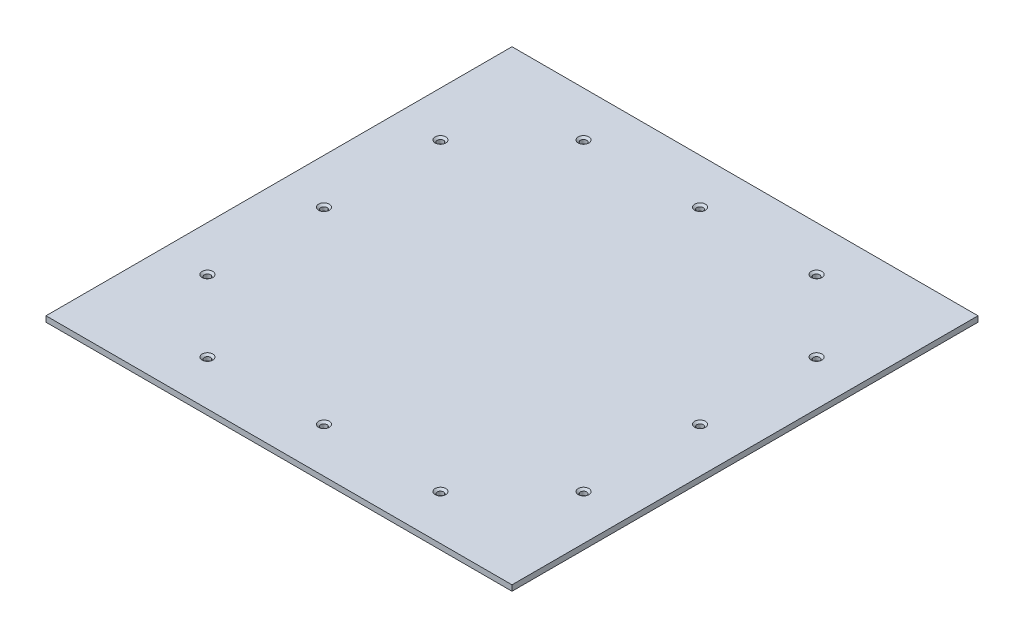
ISO-10303-21;
HEADER;
FILE_DESCRIPTION(('STEP AP214'),'2;1');
FILE_NAME('part.step','',(''),(''),'','','');
FILE_SCHEMA(('AUTOMOTIVE_DESIGN { 1 0 10303 214 1 1 1 1 }'));
ENDSEC;
DATA;
#1=APPLICATION_CONTEXT('core data for automotive mechanical design processes');
#2=APPLICATION_PROTOCOL_DEFINITION('international standard','automotive_design',2000,#1);
#3=PRODUCT_CONTEXT('',#1,'mechanical');
#4=PRODUCT('Part','Part','',(#3));
#5=PRODUCT_RELATED_PRODUCT_CATEGORY('part','',(#4));
#6=PRODUCT_DEFINITION_FORMATION('','',#4);
#7=PRODUCT_DEFINITION_CONTEXT('part definition',#1,'design');
#8=PRODUCT_DEFINITION('design','',#6,#7);
#9=PRODUCT_DEFINITION_SHAPE('','',#8);
#10=(LENGTH_UNIT() NAMED_UNIT(*) SI_UNIT(.MILLI.,.METRE.));
#11=(NAMED_UNIT(*) PLANE_ANGLE_UNIT() SI_UNIT($,.RADIAN.));
#12=(NAMED_UNIT(*) SI_UNIT($,.STERADIAN.) SOLID_ANGLE_UNIT());
#13=UNCERTAINTY_MEASURE_WITH_UNIT(LENGTH_MEASURE(1.E-05),#10,'distance_accuracy_value','');
#14=(GEOMETRIC_REPRESENTATION_CONTEXT(3) GLOBAL_UNCERTAINTY_ASSIGNED_CONTEXT((#13)) GLOBAL_UNIT_ASSIGNED_CONTEXT((#10,
#11,#12)) REPRESENTATION_CONTEXT('',''));
#15=CARTESIAN_POINT('',(0.,0.,0.));
#16=DIRECTION('',(0.,0.,1.));
#17=DIRECTION('',(1.,0.,0.));
#18=AXIS2_PLACEMENT_3D('',#15,#16,#17);
#19=CARTESIAN_POINT('',(65.821179,76.933679,65.821179));
#20=DIRECTION('',(1.,0.,0.));
#21=DIRECTION('',(0.,0.,1.));
#22=AXIS2_PLACEMENT_3D('',#19,#20,#21);
#23=PLANE('',#22);
#24=DIRECTION('',(0.,0.,1.));
#25=VECTOR('',#24,1.);
#26=CARTESIAN_POINT('',(65.821179,75.346179,65.821179));
#27=LINE('',#26,#25);
#28=CARTESIAN_POINT('',(65.821179,75.346179,-65.821179));
#29=VERTEX_POINT('',#28);
#30=CARTESIAN_POINT('',(65.821179,75.346179,65.821179));
#31=VERTEX_POINT('',#30);
#32=EDGE_CURVE('E81',#29,#31,#27,.T.);
#33=ORIENTED_EDGE('',*,*,#32,.F.);
#34=DIRECTION('',(0.,-1.,0.));
#35=VECTOR('',#34,1.);
#36=CARTESIAN_POINT('',(65.821179,76.933679,-65.821179));
#37=LINE('',#36,#35);
#38=CARTESIAN_POINT('',(65.821179,76.933679,-65.821179));
#39=VERTEX_POINT('',#38);
#40=EDGE_CURVE('E10',#39,#29,#37,.T.);
#41=ORIENTED_EDGE('',*,*,#40,.F.);
#42=DIRECTION('',(0.,0.,1.));
#43=VECTOR('',#42,1.);
#44=CARTESIAN_POINT('',(65.821179,76.933679,65.821179));
#45=LINE('',#44,#43);
#46=CARTESIAN_POINT('',(65.821179,76.933679,65.821179));
#47=VERTEX_POINT('',#46);
#48=EDGE_CURVE('E74',#39,#47,#45,.T.);
#49=ORIENTED_EDGE('',*,*,#48,.T.);
#50=DIRECTION('',(0.,-1.,0.));
#51=VECTOR('',#50,1.);
#52=CARTESIAN_POINT('',(65.821179,76.933679,65.821179));
#53=LINE('',#52,#51);
#54=EDGE_CURVE('E19',#47,#31,#53,.T.);
#55=ORIENTED_EDGE('',*,*,#54,.T.);
#56=EDGE_LOOP('',(#33,#41,#49,#55));
#57=FACE_BOUND('',#56,.T.);
#58=ADVANCED_FACE('F16',(#57),#23,.T.);
#59=CARTESIAN_POINT('',(65.821179,76.933679,-65.821179));
#60=DIRECTION('',(0.,0.,-1.));
#61=DIRECTION('',(1.,0.,0.));
#62=AXIS2_PLACEMENT_3D('',#59,#60,#61);
#63=PLANE('',#62);
#64=DIRECTION('',(1.,0.,0.));
#65=VECTOR('',#64,1.);
#66=CARTESIAN_POINT('',(65.821179,75.346179,-65.821179));
#67=LINE('',#66,#65);
#68=CARTESIAN_POINT('',(-65.821179,75.346179,-65.821179));
#69=VERTEX_POINT('',#68);
#70=EDGE_CURVE('E76',#69,#29,#67,.T.);
#71=ORIENTED_EDGE('',*,*,#70,.F.);
#72=DIRECTION('',(0.,-1.,0.));
#73=VECTOR('',#72,1.);
#74=CARTESIAN_POINT('',(-65.821179,76.933679,-65.821179));
#75=LINE('',#74,#73);
#76=CARTESIAN_POINT('',(-65.821179,76.933679,-65.821179));
#77=VERTEX_POINT('',#76);
#78=EDGE_CURVE('E25',#77,#69,#75,.T.);
#79=ORIENTED_EDGE('',*,*,#78,.F.);
#80=DIRECTION('',(1.,0.,0.));
#81=VECTOR('',#80,1.);
#82=CARTESIAN_POINT('',(65.821179,76.933679,-65.821179));
#83=LINE('',#82,#81);
#84=EDGE_CURVE('E71',#77,#39,#83,.T.);
#85=ORIENTED_EDGE('',*,*,#84,.T.);
#86=ORIENTED_EDGE('',*,*,#40,.T.);
#87=EDGE_LOOP('',(#71,#79,#85,#86));
#88=FACE_BOUND('',#87,.T.);
#89=ADVANCED_FACE('F92',(#88),#63,.T.);
#90=CARTESIAN_POINT('',(-65.821179,76.933679,65.821179));
#91=DIRECTION('',(-1.,0.,0.));
#92=DIRECTION('',(0.,0.,-1.));
#93=AXIS2_PLACEMENT_3D('',#90,#91,#92);
#94=PLANE('',#93);
#95=DIRECTION('',(0.,0.,-1.));
#96=VECTOR('',#95,1.);
#97=CARTESIAN_POINT('',(-65.821179,75.346179,65.821179));
#98=LINE('',#97,#96);
#99=CARTESIAN_POINT('',(-65.821179,75.346179,65.821179));
#100=VERTEX_POINT('',#99);
#101=EDGE_CURVE('E66',#100,#69,#98,.T.);
#102=ORIENTED_EDGE('',*,*,#101,.F.);
#103=DIRECTION('',(0.,-1.,0.));
#104=VECTOR('',#103,1.);
#105=CARTESIAN_POINT('',(-65.821179,76.933679,65.821179));
#106=LINE('',#105,#104);
#107=CARTESIAN_POINT('',(-65.821179,76.933679,65.821179));
#108=VERTEX_POINT('',#107);
#109=EDGE_CURVE('E61',#108,#100,#106,.T.);
#110=ORIENTED_EDGE('',*,*,#109,.F.);
#111=DIRECTION('',(0.,0.,-1.));
#112=VECTOR('',#111,1.);
#113=CARTESIAN_POINT('',(-65.821179,76.933679,65.821179));
#114=LINE('',#113,#112);
#115=EDGE_CURVE('E64',#108,#77,#114,.T.);
#116=ORIENTED_EDGE('',*,*,#115,.T.);
#117=ORIENTED_EDGE('',*,*,#78,.T.);
#118=EDGE_LOOP('',(#102,#110,#116,#117));
#119=FACE_BOUND('',#118,.T.);
#120=ADVANCED_FACE('F63',(#119),#94,.T.);
#121=CARTESIAN_POINT('',(65.821179,76.933679,65.821179));
#122=DIRECTION('',(0.,0.,1.));
#123=DIRECTION('',(-1.,0.,0.));
#124=AXIS2_PLACEMENT_3D('',#121,#122,#123);
#125=PLANE('',#124);
#126=DIRECTION('',(-1.,0.,0.));
#127=VECTOR('',#126,1.);
#128=CARTESIAN_POINT('',(65.821179,75.346179,65.821179));
#129=LINE('',#128,#127);
#130=EDGE_CURVE('E84',#31,#100,#129,.T.);
#131=ORIENTED_EDGE('',*,*,#130,.F.);
#132=ORIENTED_EDGE('',*,*,#54,.F.);
#133=DIRECTION('',(-1.,0.,0.));
#134=VECTOR('',#133,1.);
#135=CARTESIAN_POINT('',(65.821179,76.933679,65.821179));
#136=LINE('',#135,#134);
#137=EDGE_CURVE('E70',#47,#108,#136,.T.);
#138=ORIENTED_EDGE('',*,*,#137,.T.);
#139=ORIENTED_EDGE('',*,*,#109,.T.);
#140=EDGE_LOOP('',(#131,#132,#138,#139));
#141=FACE_BOUND('',#140,.T.);
#142=ADVANCED_FACE('F73',(#141),#125,.T.);
#143=CARTESIAN_POINT('',(65.821179,76.933679,-65.821179));
#144=DIRECTION('',(0.,1.,0.));
#145=DIRECTION('',(0.,0.,-1.));
#146=AXIS2_PLACEMENT_3D('',#143,#144,#145);
#147=PLANE('',#146);
#148=CARTESIAN_POINT('',(-53.1211790000003,76.933679,32.9105894999995));
#149=DIRECTION('',(0.,1.,0.));
#150=DIRECTION('',(0.,0.,-1.));
#151=AXIS2_PLACEMENT_3D('',#148,#149,#150);
#152=CIRCLE('',#151,1.5113);
#153=CARTESIAN_POINT('',(-53.1211790000003,76.933679,31.3992894999995));
#154=VERTEX_POINT('',#153);
#155=EDGE_CURVE('E221',#154,#154,#152,.T.);
#156=ORIENTED_EDGE('',*,*,#155,.F.);
#157=EDGE_LOOP('',(#156));
#158=FACE_BOUND('',#157,.T.);
#159=CARTESIAN_POINT('',(-53.121179,76.933679,-5.54508773728232E-13));
#160=DIRECTION('',(0.,1.,0.));
#161=DIRECTION('',(0.,0.,-1.));
#162=AXIS2_PLACEMENT_3D('',#159,#160,#161);
#163=CIRCLE('',#162,1.5113);
#164=CARTESIAN_POINT('',(-53.121179,76.933679,-1.51130000000055));
#165=VERTEX_POINT('',#164);
#166=EDGE_CURVE('E228',#165,#165,#163,.T.);
#167=ORIENTED_EDGE('',*,*,#166,.F.);
#168=EDGE_LOOP('',(#167));
#169=FACE_BOUND('',#168,.T.);
#170=CARTESIAN_POINT('',(-53.1211789999996,76.933679,-32.9105895000006));
#171=DIRECTION('',(0.,1.,0.));
#172=DIRECTION('',(0.,0.,-1.));
#173=AXIS2_PLACEMENT_3D('',#170,#171,#172);
#174=CIRCLE('',#173,1.5113);
#175=CARTESIAN_POINT('',(-53.1211789999996,76.933679,-34.4218895000006));
#176=VERTEX_POINT('',#175);
#177=EDGE_CURVE('E237',#176,#176,#174,.T.);
#178=ORIENTED_EDGE('',*,*,#177,.F.);
#179=EDGE_LOOP('',(#178));
#180=FACE_BOUND('',#179,.T.);
#181=CARTESIAN_POINT('',(32.9105894999996,76.933679,53.1211790000002));
#182=DIRECTION('',(0.,1.,0.));
#183=DIRECTION('',(0.,0.,-1.));
#184=AXIS2_PLACEMENT_3D('',#181,#182,#183);
#185=CIRCLE('',#184,1.5113);
#186=CARTESIAN_POINT('',(32.9105894999996,76.933679,51.6098790000002));
#187=VERTEX_POINT('',#186);
#188=EDGE_CURVE('E246',#187,#187,#185,.T.);
#189=ORIENTED_EDGE('',*,*,#188,.F.);
#190=EDGE_LOOP('',(#189));
#191=FACE_BOUND('',#190,.T.);
#192=CARTESIAN_POINT('',(-3.69037061127219E-13,76.933679,53.121179));
#193=DIRECTION('',(0.,1.,0.));
#194=DIRECTION('',(0.,0.,-1.));
#195=AXIS2_PLACEMENT_3D('',#192,#193,#194);
#196=CIRCLE('',#195,1.5113);
#197=CARTESIAN_POINT('',(-3.69037061127219E-13,76.933679,51.609879));
#198=VERTEX_POINT('',#197);
#199=EDGE_CURVE('E255',#198,#198,#196,.T.);
#200=ORIENTED_EDGE('',*,*,#199,.F.);
#201=EDGE_LOOP('',(#200));
#202=FACE_BOUND('',#201,.T.);
#203=CARTESIAN_POINT('',(-32.9105895000004,76.933679,53.1211789999997));
#204=DIRECTION('',(0.,1.,0.));
#205=DIRECTION('',(0.,0.,-1.));
#206=AXIS2_PLACEMENT_3D('',#203,#204,#205);
#207=CIRCLE('',#206,1.5113);
#208=CARTESIAN_POINT('',(-32.9105895000004,76.933679,51.6098789999997));
#209=VERTEX_POINT('',#208);
#210=EDGE_CURVE('E264',#209,#209,#207,.T.);
#211=ORIENTED_EDGE('',*,*,#210,.F.);
#212=EDGE_LOOP('',(#211));
#213=FACE_BOUND('',#212,.T.);
#214=CARTESIAN_POINT('',(53.1211790000001,76.933679,-32.9105894999998));
#215=DIRECTION('',(0.,1.,0.));
#216=DIRECTION('',(0.,0.,-1.));
#217=AXIS2_PLACEMENT_3D('',#214,#215,#216);
#218=CIRCLE('',#217,1.5113);
#219=CARTESIAN_POINT('',(53.1211790000001,76.933679,-34.4218894999998));
#220=VERTEX_POINT('',#219);
#221=EDGE_CURVE('E273',#220,#220,#218,.T.);
#222=ORIENTED_EDGE('',*,*,#221,.F.);
#223=EDGE_LOOP('',(#222));
#224=FACE_BOUND('',#223,.T.);
#225=CARTESIAN_POINT('',(53.121179,76.933679,1.83565348526206E-13));
#226=DIRECTION('',(0.,1.,0.));
#227=DIRECTION('',(0.,0.,-1.));
#228=AXIS2_PLACEMENT_3D('',#225,#226,#227);
#229=CIRCLE('',#228,1.5113);
#230=CARTESIAN_POINT('',(53.121179,76.933679,-1.51129999999982));
#231=VERTEX_POINT('',#230);
#232=EDGE_CURVE('E282',#231,#231,#229,.T.);
#233=ORIENTED_EDGE('',*,*,#232,.F.);
#234=EDGE_LOOP('',(#233));
#235=FACE_BOUND('',#234,.T.);
#236=CARTESIAN_POINT('',(53.1211789999998,76.933679,32.9105895000002));
#237=DIRECTION('',(0.,1.,0.));
#238=DIRECTION('',(0.,0.,-1.));
#239=AXIS2_PLACEMENT_3D('',#236,#237,#238);
#240=CIRCLE('',#239,1.5113);
#241=CARTESIAN_POINT('',(53.1211789999998,76.933679,31.3992895000002));
#242=VERTEX_POINT('',#241);
#243=EDGE_CURVE('E291',#242,#242,#240,.T.);
#244=ORIENTED_EDGE('',*,*,#243,.F.);
#245=EDGE_LOOP('',(#244));
#246=FACE_BOUND('',#245,.T.);
#247=CARTESIAN_POINT('',(-32.9105895,76.933679,-53.121179));
#248=DIRECTION('',(0.,1.,0.));
#249=DIRECTION('',(0.,0.,-1.));
#250=AXIS2_PLACEMENT_3D('',#247,#248,#249);
#251=CIRCLE('',#250,1.5113);
#252=CARTESIAN_POINT('',(-32.9105895,76.933679,-54.632479));
#253=VERTEX_POINT('',#252);
#254=EDGE_CURVE('E300',#253,#253,#251,.T.);
#255=ORIENTED_EDGE('',*,*,#254,.F.);
#256=EDGE_LOOP('',(#255));
#257=FACE_BOUND('',#256,.T.);
#258=CARTESIAN_POINT('',(0.,76.933679,-53.121179));
#259=DIRECTION('',(0.,1.,0.));
#260=DIRECTION('',(0.,0.,-1.));
#261=AXIS2_PLACEMENT_3D('',#258,#259,#260);
#262=CIRCLE('',#261,1.5113);
#263=CARTESIAN_POINT('',(0.,76.933679,-54.632479));
#264=VERTEX_POINT('',#263);
#265=EDGE_CURVE('E309',#264,#264,#262,.T.);
#266=ORIENTED_EDGE('',*,*,#265,.F.);
#267=EDGE_LOOP('',(#266));
#268=FACE_BOUND('',#267,.T.);
#269=CARTESIAN_POINT('',(32.9105895,76.933679,-53.121179));
#270=DIRECTION('',(0.,1.,0.));
#271=DIRECTION('',(0.,0.,-1.));
#272=AXIS2_PLACEMENT_3D('',#269,#270,#271);
#273=CIRCLE('',#272,1.5113);
#274=CARTESIAN_POINT('',(32.9105895,76.933679,-54.632479));
#275=VERTEX_POINT('',#274);
#276=EDGE_CURVE('E318',#275,#275,#273,.T.);
#277=ORIENTED_EDGE('',*,*,#276,.F.);
#278=EDGE_LOOP('',(#277));
#279=FACE_BOUND('',#278,.T.);
#280=ORIENTED_EDGE('',*,*,#48,.F.);
#281=ORIENTED_EDGE('',*,*,#84,.F.);
#282=ORIENTED_EDGE('',*,*,#115,.F.);
#283=ORIENTED_EDGE('',*,*,#137,.F.);
#284=EDGE_LOOP('',(#280,#281,#282,#283));
#285=FACE_BOUND('',#284,.T.);
#286=ADVANCED_FACE('F69',(#158,#169,#180,#191,#202,#213,#224,#235,#246,#257,#268,#279,#285),
#147,.T.);
#287=CARTESIAN_POINT('',(65.821179,75.346179,-65.821179));
#288=DIRECTION('',(0.,1.,0.));
#289=DIRECTION('',(0.,0.,-1.));
#290=AXIS2_PLACEMENT_3D('',#287,#288,#289);
#291=PLANE('',#290);
#292=CARTESIAN_POINT('',(-53.1211790000003,75.346179,32.9105894999995));
#293=DIRECTION('',(0.,1.,0.));
#294=DIRECTION('',(0.,0.,-1.));
#295=AXIS2_PLACEMENT_3D('',#292,#293,#294);
#296=CIRCLE('',#295,0.889000000000001);
#297=CARTESIAN_POINT('',(-53.1211790000003,75.346179,32.0215894999995));
#298=VERTEX_POINT('',#297);
#299=EDGE_CURVE('E223',#298,#298,#296,.T.);
#300=ORIENTED_EDGE('',*,*,#299,.T.);
#301=EDGE_LOOP('',(#300));
#302=FACE_BOUND('',#301,.T.);
#303=CARTESIAN_POINT('',(-53.121179,75.346179,-5.54508773728232E-13));
#304=DIRECTION('',(0.,1.,0.));
#305=DIRECTION('',(0.,0.,-1.));
#306=AXIS2_PLACEMENT_3D('',#303,#304,#305);
#307=CIRCLE('',#306,0.889000000000001);
#308=CARTESIAN_POINT('',(-53.121179,75.346179,-0.889000000000556));
#309=VERTEX_POINT('',#308);
#310=EDGE_CURVE('E234',#309,#309,#307,.T.);
#311=ORIENTED_EDGE('',*,*,#310,.T.);
#312=EDGE_LOOP('',(#311));
#313=FACE_BOUND('',#312,.T.);
#314=CARTESIAN_POINT('',(-53.1211789999996,75.346179,-32.9105895000006));
#315=DIRECTION('',(0.,1.,0.));
#316=DIRECTION('',(0.,0.,-1.));
#317=AXIS2_PLACEMENT_3D('',#314,#315,#316);
#318=CIRCLE('',#317,0.889000000000001);
#319=CARTESIAN_POINT('',(-53.1211789999996,75.346179,-33.7995895000006));
#320=VERTEX_POINT('',#319);
#321=EDGE_CURVE('E243',#320,#320,#318,.T.);
#322=ORIENTED_EDGE('',*,*,#321,.T.);
#323=EDGE_LOOP('',(#322));
#324=FACE_BOUND('',#323,.T.);
#325=CARTESIAN_POINT('',(32.9105894999996,75.346179,53.1211790000002));
#326=DIRECTION('',(0.,1.,0.));
#327=DIRECTION('',(0.,0.,-1.));
#328=AXIS2_PLACEMENT_3D('',#325,#326,#327);
#329=CIRCLE('',#328,0.889000000000001);
#330=CARTESIAN_POINT('',(32.9105894999996,75.346179,52.2321790000002));
#331=VERTEX_POINT('',#330);
#332=EDGE_CURVE('E252',#331,#331,#329,.T.);
#333=ORIENTED_EDGE('',*,*,#332,.T.);
#334=EDGE_LOOP('',(#333));
#335=FACE_BOUND('',#334,.T.);
#336=CARTESIAN_POINT('',(-3.69037061127219E-13,75.346179,53.121179));
#337=DIRECTION('',(0.,1.,0.));
#338=DIRECTION('',(0.,0.,-1.));
#339=AXIS2_PLACEMENT_3D('',#336,#337,#338);
#340=CIRCLE('',#339,0.889);
#341=CARTESIAN_POINT('',(-3.69037061127219E-13,75.346179,52.232179));
#342=VERTEX_POINT('',#341);
#343=EDGE_CURVE('E261',#342,#342,#340,.T.);
#344=ORIENTED_EDGE('',*,*,#343,.T.);
#345=EDGE_LOOP('',(#344));
#346=FACE_BOUND('',#345,.T.);
#347=CARTESIAN_POINT('',(-32.9105895000004,75.346179,53.1211789999997));
#348=DIRECTION('',(0.,1.,0.));
#349=DIRECTION('',(0.,0.,-1.));
#350=AXIS2_PLACEMENT_3D('',#347,#348,#349);
#351=CIRCLE('',#350,0.889000000000001);
#352=CARTESIAN_POINT('',(-32.9105895000004,75.346179,52.2321789999997));
#353=VERTEX_POINT('',#352);
#354=EDGE_CURVE('E270',#353,#353,#351,.T.);
#355=ORIENTED_EDGE('',*,*,#354,.T.);
#356=EDGE_LOOP('',(#355));
#357=FACE_BOUND('',#356,.T.);
#358=CARTESIAN_POINT('',(53.1211790000001,75.346179,-32.9105894999998));
#359=DIRECTION('',(0.,1.,0.));
#360=DIRECTION('',(0.,0.,-1.));
#361=AXIS2_PLACEMENT_3D('',#358,#359,#360);
#362=CIRCLE('',#361,0.889000000000001);
#363=CARTESIAN_POINT('',(53.1211790000001,75.346179,-33.7995894999998));
#364=VERTEX_POINT('',#363);
#365=EDGE_CURVE('E279',#364,#364,#362,.T.);
#366=ORIENTED_EDGE('',*,*,#365,.T.);
#367=EDGE_LOOP('',(#366));
#368=FACE_BOUND('',#367,.T.);
#369=CARTESIAN_POINT('',(53.121179,75.346179,1.83565348526206E-13));
#370=DIRECTION('',(0.,1.,0.));
#371=DIRECTION('',(0.,0.,-1.));
#372=AXIS2_PLACEMENT_3D('',#369,#370,#371);
#373=CIRCLE('',#372,0.889000000000001);
#374=CARTESIAN_POINT('',(53.121179,75.346179,-0.888999999999818));
#375=VERTEX_POINT('',#374);
#376=EDGE_CURVE('E288',#375,#375,#373,.T.);
#377=ORIENTED_EDGE('',*,*,#376,.T.);
#378=EDGE_LOOP('',(#377));
#379=FACE_BOUND('',#378,.T.);
#380=CARTESIAN_POINT('',(53.1211789999998,75.346179,32.9105895000002));
#381=DIRECTION('',(0.,1.,0.));
#382=DIRECTION('',(0.,0.,-1.));
#383=AXIS2_PLACEMENT_3D('',#380,#381,#382);
#384=CIRCLE('',#383,0.889000000000001);
#385=CARTESIAN_POINT('',(53.1211789999998,75.346179,32.0215895000002));
#386=VERTEX_POINT('',#385);
#387=EDGE_CURVE('E297',#386,#386,#384,.T.);
#388=ORIENTED_EDGE('',*,*,#387,.T.);
#389=EDGE_LOOP('',(#388));
#390=FACE_BOUND('',#389,.T.);
#391=CARTESIAN_POINT('',(-32.9105895,75.346179,-53.121179));
#392=DIRECTION('',(0.,1.,0.));
#393=DIRECTION('',(0.,0.,-1.));
#394=AXIS2_PLACEMENT_3D('',#391,#392,#393);
#395=CIRCLE('',#394,0.889000000000001);
#396=CARTESIAN_POINT('',(-32.9105895,75.346179,-54.010179));
#397=VERTEX_POINT('',#396);
#398=EDGE_CURVE('E306',#397,#397,#395,.T.);
#399=ORIENTED_EDGE('',*,*,#398,.T.);
#400=EDGE_LOOP('',(#399));
#401=FACE_BOUND('',#400,.T.);
#402=CARTESIAN_POINT('',(0.,75.346179,-53.121179));
#403=DIRECTION('',(0.,1.,0.));
#404=DIRECTION('',(0.,0.,-1.));
#405=AXIS2_PLACEMENT_3D('',#402,#403,#404);
#406=CIRCLE('',#405,0.889);
#407=CARTESIAN_POINT('',(0.,75.346179,-54.010179));
#408=VERTEX_POINT('',#407);
#409=EDGE_CURVE('E315',#408,#408,#406,.T.);
#410=ORIENTED_EDGE('',*,*,#409,.T.);
#411=EDGE_LOOP('',(#410));
#412=FACE_BOUND('',#411,.T.);
#413=CARTESIAN_POINT('',(32.9105895,75.346179,-53.121179));
#414=DIRECTION('',(0.,1.,0.));
#415=DIRECTION('',(0.,0.,-1.));
#416=AXIS2_PLACEMENT_3D('',#413,#414,#415);
#417=CIRCLE('',#416,0.889000000000001);
#418=CARTESIAN_POINT('',(32.9105895,75.346179,-54.010179));
#419=VERTEX_POINT('',#418);
#420=EDGE_CURVE('E85',#419,#419,#417,.T.);
#421=ORIENTED_EDGE('',*,*,#420,.T.);
#422=EDGE_LOOP('',(#421));
#423=FACE_BOUND('',#422,.T.);
#424=ORIENTED_EDGE('',*,*,#32,.T.);
#425=ORIENTED_EDGE('',*,*,#130,.T.);
#426=ORIENTED_EDGE('',*,*,#101,.T.);
#427=ORIENTED_EDGE('',*,*,#70,.T.);
#428=EDGE_LOOP('',(#424,#425,#426,#427));
#429=FACE_BOUND('',#428,.T.);
#430=ADVANCED_FACE('F91',(#302,#313,#324,#335,#346,#357,#368,#379,#390,#401,#412,#423,#429),
#291,.F.);
#431=CARTESIAN_POINT('',(32.9105895,76.933679,-53.121179));
#432=DIRECTION('',(0.,1.,0.));
#433=DIRECTION('',(0.,0.,-1.));
#434=AXIS2_PLACEMENT_3D('',#431,#432,#433);
#435=CYLINDRICAL_SURFACE('',#434,0.888999999999997);
#436=ORIENTED_EDGE('',*,*,#420,.F.);
#437=EDGE_LOOP('',(#436));
#438=FACE_BOUND('',#437,.T.);
#439=CARTESIAN_POINT('',(32.9105895,76.4115072995184,-53.121179));
#440=DIRECTION('',(0.,1.,0.));
#441=DIRECTION('',(0.,0.,-1.));
#442=AXIS2_PLACEMENT_3D('',#439,#440,#441);
#443=CIRCLE('',#442,0.888999999999994);
#444=CARTESIAN_POINT('',(32.9105895,76.4115072995184,-54.010179));
#445=VERTEX_POINT('',#444);
#446=EDGE_CURVE('E321',#445,#445,#443,.T.);
#447=ORIENTED_EDGE('',*,*,#446,.T.);
#448=EDGE_LOOP('',(#447));
#449=FACE_BOUND('',#448,.T.);
#450=ADVANCED_FACE('F114',(#438,#449),#435,.F.);
#451=CARTESIAN_POINT('',(32.9105895,76.933679,-53.121179));
#452=DIRECTION('',(0.,1.,0.));
#453=DIRECTION('',(0.,0.,-1.));
#454=AXIS2_PLACEMENT_3D('',#451,#452,#453);
#455=CONICAL_SURFACE('',#454,1.5113,0.872664625997172);
#456=ORIENTED_EDGE('',*,*,#446,.F.);
#457=EDGE_LOOP('',(#456));
#458=FACE_BOUND('',#457,.T.);
#459=ORIENTED_EDGE('',*,*,#276,.T.);
#460=EDGE_LOOP('',(#459));
#461=FACE_BOUND('',#460,.T.);
#462=ADVANCED_FACE('F121',(#458,#461),#455,.F.);
#463=CARTESIAN_POINT('',(0.,76.933679,-53.121179));
#464=DIRECTION('',(0.,1.,0.));
#465=DIRECTION('',(0.,0.,-1.));
#466=AXIS2_PLACEMENT_3D('',#463,#464,#465);
#467=CYLINDRICAL_SURFACE('',#466,0.888999999999998);
#468=ORIENTED_EDGE('',*,*,#409,.F.);
#469=EDGE_LOOP('',(#468));
#470=FACE_BOUND('',#469,.T.);
#471=CARTESIAN_POINT('',(0.,76.4115072995184,-53.121179));
#472=DIRECTION('',(0.,1.,0.));
#473=DIRECTION('',(0.,0.,-1.));
#474=AXIS2_PLACEMENT_3D('',#471,#472,#473);
#475=CIRCLE('',#474,0.888999999999997);
#476=CARTESIAN_POINT('',(0.,76.4115072995184,-54.010179));
#477=VERTEX_POINT('',#476);
#478=EDGE_CURVE('E312',#477,#477,#475,.T.);
#479=ORIENTED_EDGE('',*,*,#478,.T.);
#480=EDGE_LOOP('',(#479));
#481=FACE_BOUND('',#480,.T.);
#482=ADVANCED_FACE('F125',(#470,#481),#467,.F.);
#483=CARTESIAN_POINT('',(0.,76.933679,-53.121179));
#484=DIRECTION('',(0.,1.,0.));
#485=DIRECTION('',(0.,0.,-1.));
#486=AXIS2_PLACEMENT_3D('',#483,#484,#485);
#487=CONICAL_SURFACE('',#486,1.5113,0.87266462599717);
#488=ORIENTED_EDGE('',*,*,#478,.F.);
#489=EDGE_LOOP('',(#488));
#490=FACE_BOUND('',#489,.T.);
#491=ORIENTED_EDGE('',*,*,#265,.T.);
#492=EDGE_LOOP('',(#491));
#493=FACE_BOUND('',#492,.T.);
#494=ADVANCED_FACE('F129',(#490,#493),#487,.F.);
#495=CARTESIAN_POINT('',(-32.9105895,76.933679,-53.121179));
#496=DIRECTION('',(0.,1.,0.));
#497=DIRECTION('',(0.,0.,-1.));
#498=AXIS2_PLACEMENT_3D('',#495,#496,#497);
#499=CYLINDRICAL_SURFACE('',#498,0.888999999999997);
#500=ORIENTED_EDGE('',*,*,#398,.F.);
#501=EDGE_LOOP('',(#500));
#502=FACE_BOUND('',#501,.T.);
#503=CARTESIAN_POINT('',(-32.9105895,76.4115072995184,-53.121179));
#504=DIRECTION('',(0.,1.,0.));
#505=DIRECTION('',(0.,0.,-1.));
#506=AXIS2_PLACEMENT_3D('',#503,#504,#505);
#507=CIRCLE('',#506,0.888999999999994);
#508=CARTESIAN_POINT('',(-32.9105895,76.4115072995184,-54.010179));
#509=VERTEX_POINT('',#508);
#510=EDGE_CURVE('E303',#509,#509,#507,.T.);
#511=ORIENTED_EDGE('',*,*,#510,.T.);
#512=EDGE_LOOP('',(#511));
#513=FACE_BOUND('',#512,.T.);
#514=ADVANCED_FACE('F133',(#502,#513),#499,.F.);
#515=CARTESIAN_POINT('',(-32.9105895,76.933679,-53.121179));
#516=DIRECTION('',(0.,1.,0.));
#517=DIRECTION('',(0.,0.,-1.));
#518=AXIS2_PLACEMENT_3D('',#515,#516,#517);
#519=CONICAL_SURFACE('',#518,1.5113,0.872664625997172);
#520=ORIENTED_EDGE('',*,*,#510,.F.);
#521=EDGE_LOOP('',(#520));
#522=FACE_BOUND('',#521,.T.);
#523=ORIENTED_EDGE('',*,*,#254,.T.);
#524=EDGE_LOOP('',(#523));
#525=FACE_BOUND('',#524,.T.);
#526=ADVANCED_FACE('F137',(#522,#525),#519,.F.);
#527=CARTESIAN_POINT('',(53.1211789999998,76.933679,32.9105895000002));
#528=DIRECTION('',(0.,1.,0.));
#529=DIRECTION('',(0.,0.,-1.));
#530=AXIS2_PLACEMENT_3D('',#527,#528,#529);
#531=CYLINDRICAL_SURFACE('',#530,0.888999999999997);
#532=ORIENTED_EDGE('',*,*,#387,.F.);
#533=EDGE_LOOP('',(#532));
#534=FACE_BOUND('',#533,.T.);
#535=CARTESIAN_POINT('',(53.1211789999998,76.4115072995184,32.9105895000002));
#536=DIRECTION('',(0.,1.,0.));
#537=DIRECTION('',(0.,0.,-1.));
#538=AXIS2_PLACEMENT_3D('',#535,#536,#537);
#539=CIRCLE('',#538,0.888999999999994);
#540=CARTESIAN_POINT('',(53.1211789999998,76.4115072995184,32.0215895000002));
#541=VERTEX_POINT('',#540);
#542=EDGE_CURVE('E294',#541,#541,#539,.T.);
#543=ORIENTED_EDGE('',*,*,#542,.T.);
#544=EDGE_LOOP('',(#543));
#545=FACE_BOUND('',#544,.T.);
#546=ADVANCED_FACE('F141',(#534,#545),#531,.F.);
#547=CARTESIAN_POINT('',(53.1211789999998,76.933679,32.9105895000002));
#548=DIRECTION('',(0.,1.,0.));
#549=DIRECTION('',(0.,0.,-1.));
#550=AXIS2_PLACEMENT_3D('',#547,#548,#549);
#551=CONICAL_SURFACE('',#550,1.5113,0.872664625997172);
#552=ORIENTED_EDGE('',*,*,#542,.F.);
#553=EDGE_LOOP('',(#552));
#554=FACE_BOUND('',#553,.T.);
#555=ORIENTED_EDGE('',*,*,#243,.T.);
#556=EDGE_LOOP('',(#555));
#557=FACE_BOUND('',#556,.T.);
#558=ADVANCED_FACE('F145',(#554,#557),#551,.F.);
#559=CARTESIAN_POINT('',(53.121179,76.933679,1.83565348526206E-13));
#560=DIRECTION('',(0.,1.,0.));
#561=DIRECTION('',(0.,0.,-1.));
#562=AXIS2_PLACEMENT_3D('',#559,#560,#561);
#563=CYLINDRICAL_SURFACE('',#562,0.888999999999997);
#564=ORIENTED_EDGE('',*,*,#376,.F.);
#565=EDGE_LOOP('',(#564));
#566=FACE_BOUND('',#565,.T.);
#567=CARTESIAN_POINT('',(53.121179,76.4115072995184,1.83565348526206E-13));
#568=DIRECTION('',(0.,1.,0.));
#569=DIRECTION('',(0.,0.,-1.));
#570=AXIS2_PLACEMENT_3D('',#567,#568,#569);
#571=CIRCLE('',#570,0.888999999999994);
#572=CARTESIAN_POINT('',(53.121179,76.4115072995184,-0.888999999999811));
#573=VERTEX_POINT('',#572);
#574=EDGE_CURVE('E285',#573,#573,#571,.T.);
#575=ORIENTED_EDGE('',*,*,#574,.T.);
#576=EDGE_LOOP('',(#575));
#577=FACE_BOUND('',#576,.T.);
#578=ADVANCED_FACE('F149',(#566,#577),#563,.F.);
#579=CARTESIAN_POINT('',(53.121179,76.933679,1.83565348526206E-13));
#580=DIRECTION('',(0.,1.,0.));
#581=DIRECTION('',(0.,0.,-1.));
#582=AXIS2_PLACEMENT_3D('',#579,#580,#581);
#583=CONICAL_SURFACE('',#582,1.5113,0.872664625997172);
#584=ORIENTED_EDGE('',*,*,#574,.F.);
#585=EDGE_LOOP('',(#584));
#586=FACE_BOUND('',#585,.T.);
#587=ORIENTED_EDGE('',*,*,#232,.T.);
#588=EDGE_LOOP('',(#587));
#589=FACE_BOUND('',#588,.T.);
#590=ADVANCED_FACE('F153',(#586,#589),#583,.F.);
#591=CARTESIAN_POINT('',(53.1211790000001,76.933679,-32.9105894999998));
#592=DIRECTION('',(0.,1.,0.));
#593=DIRECTION('',(0.,0.,-1.));
#594=AXIS2_PLACEMENT_3D('',#591,#592,#593);
#595=CYLINDRICAL_SURFACE('',#594,0.888999999999997);
#596=ORIENTED_EDGE('',*,*,#365,.F.);
#597=EDGE_LOOP('',(#596));
#598=FACE_BOUND('',#597,.T.);
#599=CARTESIAN_POINT('',(53.1211790000001,76.4115072995184,-32.9105894999998));
#600=DIRECTION('',(0.,1.,0.));
#601=DIRECTION('',(0.,0.,-1.));
#602=AXIS2_PLACEMENT_3D('',#599,#600,#601);
#603=CIRCLE('',#602,0.888999999999994);
#604=CARTESIAN_POINT('',(53.1211790000001,76.4115072995184,-33.7995894999998));
#605=VERTEX_POINT('',#604);
#606=EDGE_CURVE('E276',#605,#605,#603,.T.);
#607=ORIENTED_EDGE('',*,*,#606,.T.);
#608=EDGE_LOOP('',(#607));
#609=FACE_BOUND('',#608,.T.);
#610=ADVANCED_FACE('F157',(#598,#609),#595,.F.);
#611=CARTESIAN_POINT('',(53.1211790000001,76.933679,-32.9105894999998));
#612=DIRECTION('',(0.,1.,0.));
#613=DIRECTION('',(0.,0.,-1.));
#614=AXIS2_PLACEMENT_3D('',#611,#612,#613);
#615=CONICAL_SURFACE('',#614,1.5113,0.872664625997172);
#616=ORIENTED_EDGE('',*,*,#606,.F.);
#617=EDGE_LOOP('',(#616));
#618=FACE_BOUND('',#617,.T.);
#619=ORIENTED_EDGE('',*,*,#221,.T.);
#620=EDGE_LOOP('',(#619));
#621=FACE_BOUND('',#620,.T.);
#622=ADVANCED_FACE('F161',(#618,#621),#615,.F.);
#623=CARTESIAN_POINT('',(-32.9105895000004,76.933679,53.1211789999997));
#624=DIRECTION('',(0.,1.,0.));
#625=DIRECTION('',(0.,0.,-1.));
#626=AXIS2_PLACEMENT_3D('',#623,#624,#625);
#627=CYLINDRICAL_SURFACE('',#626,0.888999999999997);
#628=ORIENTED_EDGE('',*,*,#354,.F.);
#629=EDGE_LOOP('',(#628));
#630=FACE_BOUND('',#629,.T.);
#631=CARTESIAN_POINT('',(-32.9105895000004,76.4115072995184,53.1211789999997));
#632=DIRECTION('',(0.,1.,0.));
#633=DIRECTION('',(0.,0.,-1.));
#634=AXIS2_PLACEMENT_3D('',#631,#632,#633);
#635=CIRCLE('',#634,0.888999999999994);
#636=CARTESIAN_POINT('',(-32.9105895000004,76.4115072995184,52.2321789999997));
#637=VERTEX_POINT('',#636);
#638=EDGE_CURVE('E267',#637,#637,#635,.T.);
#639=ORIENTED_EDGE('',*,*,#638,.T.);
#640=EDGE_LOOP('',(#639));
#641=FACE_BOUND('',#640,.T.);
#642=ADVANCED_FACE('F165',(#630,#641),#627,.F.);
#643=CARTESIAN_POINT('',(-32.9105895000004,76.933679,53.1211789999997));
#644=DIRECTION('',(0.,1.,0.));
#645=DIRECTION('',(0.,0.,-1.));
#646=AXIS2_PLACEMENT_3D('',#643,#644,#645);
#647=CONICAL_SURFACE('',#646,1.5113,0.872664625997172);
#648=ORIENTED_EDGE('',*,*,#638,.F.);
#649=EDGE_LOOP('',(#648));
#650=FACE_BOUND('',#649,.T.);
#651=ORIENTED_EDGE('',*,*,#210,.T.);
#652=EDGE_LOOP('',(#651));
#653=FACE_BOUND('',#652,.T.);
#654=ADVANCED_FACE('F169',(#650,#653),#647,.F.);
#655=CARTESIAN_POINT('',(-3.69037061127219E-13,76.933679,53.121179));
#656=DIRECTION('',(0.,1.,0.));
#657=DIRECTION('',(0.,0.,-1.));
#658=AXIS2_PLACEMENT_3D('',#655,#656,#657);
#659=CYLINDRICAL_SURFACE('',#658,0.888999999999998);
#660=ORIENTED_EDGE('',*,*,#343,.F.);
#661=EDGE_LOOP('',(#660));
#662=FACE_BOUND('',#661,.T.);
#663=CARTESIAN_POINT('',(-3.69037061127219E-13,76.4115072995184,53.121179));
#664=DIRECTION('',(0.,1.,0.));
#665=DIRECTION('',(0.,0.,-1.));
#666=AXIS2_PLACEMENT_3D('',#663,#664,#665);
#667=CIRCLE('',#666,0.888999999999997);
#668=CARTESIAN_POINT('',(-3.69037061127219E-13,76.4115072995184,52.232179));
#669=VERTEX_POINT('',#668);
#670=EDGE_CURVE('E258',#669,#669,#667,.T.);
#671=ORIENTED_EDGE('',*,*,#670,.T.);
#672=EDGE_LOOP('',(#671));
#673=FACE_BOUND('',#672,.T.);
#674=ADVANCED_FACE('F173',(#662,#673),#659,.F.);
#675=CARTESIAN_POINT('',(-3.69037061127219E-13,76.933679,53.121179));
#676=DIRECTION('',(0.,1.,0.));
#677=DIRECTION('',(0.,0.,-1.));
#678=AXIS2_PLACEMENT_3D('',#675,#676,#677);
#679=CONICAL_SURFACE('',#678,1.5113,0.87266462599717);
#680=ORIENTED_EDGE('',*,*,#670,.F.);
#681=EDGE_LOOP('',(#680));
#682=FACE_BOUND('',#681,.T.);
#683=ORIENTED_EDGE('',*,*,#199,.T.);
#684=EDGE_LOOP('',(#683));
#685=FACE_BOUND('',#684,.T.);
#686=ADVANCED_FACE('F177',(#682,#685),#679,.F.);
#687=CARTESIAN_POINT('',(32.9105894999996,76.933679,53.1211790000002));
#688=DIRECTION('',(0.,1.,0.));
#689=DIRECTION('',(0.,0.,-1.));
#690=AXIS2_PLACEMENT_3D('',#687,#688,#689);
#691=CYLINDRICAL_SURFACE('',#690,0.888999999999997);
#692=ORIENTED_EDGE('',*,*,#332,.F.);
#693=EDGE_LOOP('',(#692));
#694=FACE_BOUND('',#693,.T.);
#695=CARTESIAN_POINT('',(32.9105894999996,76.4115072995184,53.1211790000002));
#696=DIRECTION('',(0.,1.,0.));
#697=DIRECTION('',(0.,0.,-1.));
#698=AXIS2_PLACEMENT_3D('',#695,#696,#697);
#699=CIRCLE('',#698,0.888999999999994);
#700=CARTESIAN_POINT('',(32.9105894999996,76.4115072995184,52.2321790000002));
#701=VERTEX_POINT('',#700);
#702=EDGE_CURVE('E249',#701,#701,#699,.T.);
#703=ORIENTED_EDGE('',*,*,#702,.T.);
#704=EDGE_LOOP('',(#703));
#705=FACE_BOUND('',#704,.T.);
#706=ADVANCED_FACE('F181',(#694,#705),#691,.F.);
#707=CARTESIAN_POINT('',(32.9105894999996,76.933679,53.1211790000002));
#708=DIRECTION('',(0.,1.,0.));
#709=DIRECTION('',(0.,0.,-1.));
#710=AXIS2_PLACEMENT_3D('',#707,#708,#709);
#711=CONICAL_SURFACE('',#710,1.5113,0.872664625997172);
#712=ORIENTED_EDGE('',*,*,#702,.F.);
#713=EDGE_LOOP('',(#712));
#714=FACE_BOUND('',#713,.T.);
#715=ORIENTED_EDGE('',*,*,#188,.T.);
#716=EDGE_LOOP('',(#715));
#717=FACE_BOUND('',#716,.T.);
#718=ADVANCED_FACE('F185',(#714,#717),#711,.F.);
#719=CARTESIAN_POINT('',(-53.1211789999996,76.933679,-32.9105895000006));
#720=DIRECTION('',(0.,1.,0.));
#721=DIRECTION('',(0.,0.,-1.));
#722=AXIS2_PLACEMENT_3D('',#719,#720,#721);
#723=CYLINDRICAL_SURFACE('',#722,0.888999999999997);
#724=ORIENTED_EDGE('',*,*,#321,.F.);
#725=EDGE_LOOP('',(#724));
#726=FACE_BOUND('',#725,.T.);
#727=CARTESIAN_POINT('',(-53.1211789999996,76.4115072995184,-32.9105895000006));
#728=DIRECTION('',(0.,1.,0.));
#729=DIRECTION('',(0.,0.,-1.));
#730=AXIS2_PLACEMENT_3D('',#727,#728,#729);
#731=CIRCLE('',#730,0.888999999999994);
#732=CARTESIAN_POINT('',(-53.1211789999996,76.4115072995184,-33.7995895000005));
#733=VERTEX_POINT('',#732);
#734=EDGE_CURVE('E240',#733,#733,#731,.T.);
#735=ORIENTED_EDGE('',*,*,#734,.T.);
#736=EDGE_LOOP('',(#735));
#737=FACE_BOUND('',#736,.T.);
#738=ADVANCED_FACE('F189',(#726,#737),#723,.F.);
#739=CARTESIAN_POINT('',(-53.1211789999996,76.933679,-32.9105895000006));
#740=DIRECTION('',(0.,1.,0.));
#741=DIRECTION('',(0.,0.,-1.));
#742=AXIS2_PLACEMENT_3D('',#739,#740,#741);
#743=CONICAL_SURFACE('',#742,1.5113,0.872664625997172);
#744=ORIENTED_EDGE('',*,*,#734,.F.);
#745=EDGE_LOOP('',(#744));
#746=FACE_BOUND('',#745,.T.);
#747=ORIENTED_EDGE('',*,*,#177,.T.);
#748=EDGE_LOOP('',(#747));
#749=FACE_BOUND('',#748,.T.);
#750=ADVANCED_FACE('F193',(#746,#749),#743,.F.);
#751=CARTESIAN_POINT('',(-53.121179,76.933679,-5.54508773728232E-13));
#752=DIRECTION('',(0.,1.,0.));
#753=DIRECTION('',(0.,0.,-1.));
#754=AXIS2_PLACEMENT_3D('',#751,#752,#753);
#755=CYLINDRICAL_SURFACE('',#754,0.888999999999997);
#756=ORIENTED_EDGE('',*,*,#310,.F.);
#757=EDGE_LOOP('',(#756));
#758=FACE_BOUND('',#757,.T.);
#759=CARTESIAN_POINT('',(-53.121179,76.4115072995184,-5.54508773728232E-13));
#760=DIRECTION('',(0.,1.,0.));
#761=DIRECTION('',(0.,0.,-1.));
#762=AXIS2_PLACEMENT_3D('',#759,#760,#761);
#763=CIRCLE('',#762,0.888999999999994);
#764=CARTESIAN_POINT('',(-53.121179,76.4115072995184,-0.889000000000549));
#765=VERTEX_POINT('',#764);
#766=EDGE_CURVE('E231',#765,#765,#763,.T.);
#767=ORIENTED_EDGE('',*,*,#766,.T.);
#768=EDGE_LOOP('',(#767));
#769=FACE_BOUND('',#768,.T.);
#770=ADVANCED_FACE('F197',(#758,#769),#755,.F.);
#771=CARTESIAN_POINT('',(-53.121179,76.933679,-5.54508773728232E-13));
#772=DIRECTION('',(0.,1.,0.));
#773=DIRECTION('',(0.,0.,-1.));
#774=AXIS2_PLACEMENT_3D('',#771,#772,#773);
#775=CONICAL_SURFACE('',#774,1.5113,0.872664625997172);
#776=ORIENTED_EDGE('',*,*,#766,.F.);
#777=EDGE_LOOP('',(#776));
#778=FACE_BOUND('',#777,.T.);
#779=ORIENTED_EDGE('',*,*,#166,.T.);
#780=EDGE_LOOP('',(#779));
#781=FACE_BOUND('',#780,.T.);
#782=ADVANCED_FACE('F201',(#778,#781),#775,.F.);
#783=CARTESIAN_POINT('',(-53.1211790000003,76.933679,32.9105894999995));
#784=DIRECTION('',(0.,1.,0.));
#785=DIRECTION('',(0.,0.,-1.));
#786=AXIS2_PLACEMENT_3D('',#783,#784,#785);
#787=CYLINDRICAL_SURFACE('',#786,0.888999999999997);
#788=ORIENTED_EDGE('',*,*,#299,.F.);
#789=EDGE_LOOP('',(#788));
#790=FACE_BOUND('',#789,.T.);
#791=CARTESIAN_POINT('',(-53.1211790000003,76.4115072995184,32.9105894999995));
#792=DIRECTION('',(0.,1.,0.));
#793=DIRECTION('',(0.,0.,-1.));
#794=AXIS2_PLACEMENT_3D('',#791,#792,#793);
#795=CIRCLE('',#794,0.888999999999994);
#796=CARTESIAN_POINT('',(-53.1211790000003,76.4115072995184,32.0215894999995));
#797=VERTEX_POINT('',#796);
#798=EDGE_CURVE('E219',#797,#797,#795,.T.);
#799=ORIENTED_EDGE('',*,*,#798,.T.);
#800=EDGE_LOOP('',(#799));
#801=FACE_BOUND('',#800,.T.);
#802=ADVANCED_FACE('F205',(#790,#801),#787,.F.);
#803=CARTESIAN_POINT('',(-53.1211790000003,76.933679,32.9105894999995));
#804=DIRECTION('',(0.,1.,0.));
#805=DIRECTION('',(0.,0.,-1.));
#806=AXIS2_PLACEMENT_3D('',#803,#804,#805);
#807=CONICAL_SURFACE('',#806,1.5113,0.872664625997172);
#808=ORIENTED_EDGE('',*,*,#798,.F.);
#809=EDGE_LOOP('',(#808));
#810=FACE_BOUND('',#809,.T.);
#811=ORIENTED_EDGE('',*,*,#155,.T.);
#812=EDGE_LOOP('',(#811));
#813=FACE_BOUND('',#812,.T.);
#814=ADVANCED_FACE('F209',(#810,#813),#807,.F.);
#815=CLOSED_SHELL('',(#58,#89,#120,#142,#286,#430,#450,#462,#482,#494,#514,#526,#546,#558,#578,
#590,#610,#622,#642,#654,#674,#686,#706,#718,#738,#750,#770,#782,#802,#814));
#816=MANIFOLD_SOLID_BREP('B1',#815);
#817=ADVANCED_BREP_SHAPE_REPRESENTATION('',(#18,#816),#14);
#818=SHAPE_DEFINITION_REPRESENTATION(#9,#817);
ENDSEC;
END-ISO-10303-21;
